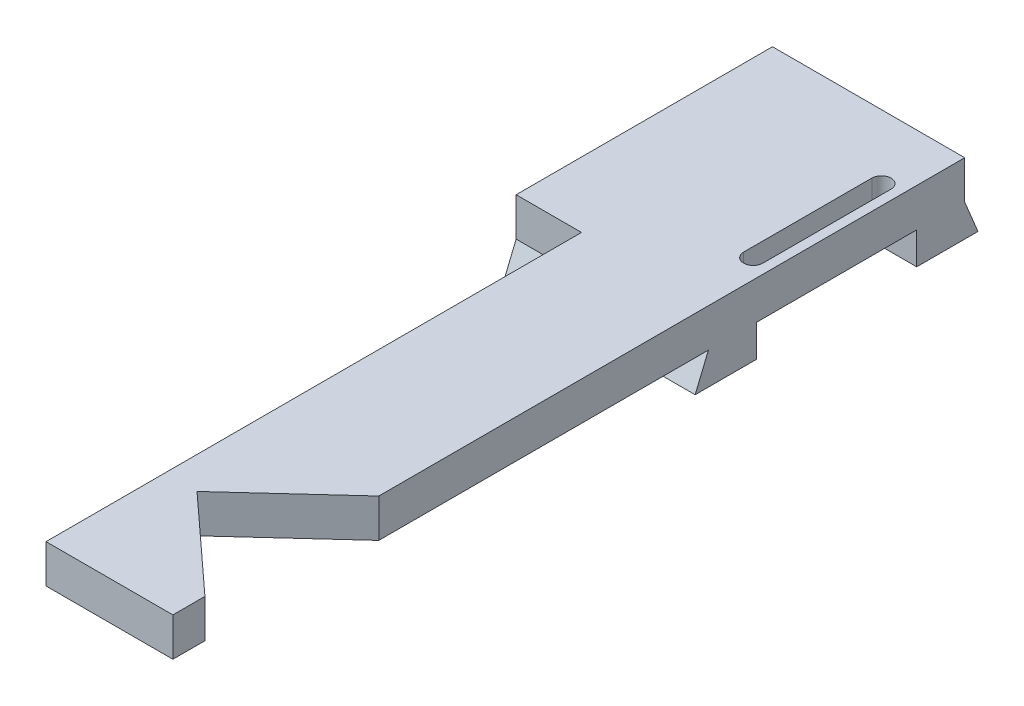
ISO-10303-21;
HEADER;
FILE_DESCRIPTION(('STEP AP214'),'2;1');
FILE_NAME('part.step','',(''),(''),'','','');
FILE_SCHEMA(('AUTOMOTIVE_DESIGN { 1 0 10303 214 1 1 1 1 }'));
ENDSEC;
DATA;
#1=APPLICATION_CONTEXT('core data for automotive mechanical design processes');
#2=APPLICATION_PROTOCOL_DEFINITION('international standard','automotive_design',2000,#1);
#3=PRODUCT_CONTEXT('',#1,'mechanical');
#4=PRODUCT('Part','Part','',(#3));
#5=PRODUCT_RELATED_PRODUCT_CATEGORY('part','',(#4));
#6=PRODUCT_DEFINITION_FORMATION('','',#4);
#7=PRODUCT_DEFINITION_CONTEXT('part definition',#1,'design');
#8=PRODUCT_DEFINITION('design','',#6,#7);
#9=PRODUCT_DEFINITION_SHAPE('','',#8);
#10=(LENGTH_UNIT() NAMED_UNIT(*) SI_UNIT(.MILLI.,.METRE.));
#11=(NAMED_UNIT(*) PLANE_ANGLE_UNIT() SI_UNIT($,.RADIAN.));
#12=(NAMED_UNIT(*) SI_UNIT($,.STERADIAN.) SOLID_ANGLE_UNIT());
#13=UNCERTAINTY_MEASURE_WITH_UNIT(LENGTH_MEASURE(1.E-05),#10,'distance_accuracy_value','');
#14=(GEOMETRIC_REPRESENTATION_CONTEXT(3) GLOBAL_UNCERTAINTY_ASSIGNED_CONTEXT((#13)) GLOBAL_UNIT_ASSIGNED_CONTEXT((#10,
#11,#12)) REPRESENTATION_CONTEXT('',''));
#15=CARTESIAN_POINT('',(0.,0.,0.));
#16=DIRECTION('',(0.,0.,1.));
#17=DIRECTION('',(1.,0.,0.));
#18=AXIS2_PLACEMENT_3D('',#15,#16,#17);
#19=CARTESIAN_POINT('',(0.,6.,0.));
#20=DIRECTION('',(1.,0.,0.));
#21=DIRECTION('',(0.,0.,-1.));
#22=AXIS2_PLACEMENT_3D('',#19,#20,#21);
#23=PLANE('',#22);
#24=DIRECTION('',(0.,0.,1.));
#25=VECTOR('',#24,1.);
#26=CARTESIAN_POINT('',(0.,0.,0.));
#27=LINE('',#26,#25);
#28=CARTESIAN_POINT('',(0.,0.,-12.5));
#29=VERTEX_POINT('',#28);
#30=CARTESIAN_POINT('',(0.,0.,12.5));
#31=VERTEX_POINT('',#30);
#32=EDGE_CURVE('E330',#29,#31,#27,.T.);
#33=ORIENTED_EDGE('',*,*,#32,.F.);
#34=DIRECTION('',(0.,1.,0.));
#35=VECTOR('',#34,1.);
#36=CARTESIAN_POINT('',(0.,0.,-12.5));
#37=LINE('',#36,#35);
#38=CARTESIAN_POINT('',(0.,-5.,-12.5));
#39=VERTEX_POINT('',#38);
#40=EDGE_CURVE('E275',#39,#29,#37,.T.);
#41=ORIENTED_EDGE('',*,*,#40,.F.);
#42=DIRECTION('',(0.,0.,-1.));
#43=VECTOR('',#42,1.);
#44=CARTESIAN_POINT('',(0.,-5.,0.));
#45=LINE('',#44,#43);
#46=CARTESIAN_POINT('',(0.,-5.,-22.069851171331));
#47=VERTEX_POINT('',#46);
#48=EDGE_CURVE('E255',#39,#47,#45,.T.);
#49=ORIENTED_EDGE('',*,*,#48,.T.);
#50=DIRECTION('',(0.,0.923959000291111,0.382491523802882));
#51=VECTOR('',#50,1.);
#52=CARTESIAN_POINT('',(0.,7.0681297190547,-17.074004684379));
#53=LINE('',#52,#51);
#54=CARTESIAN_POINT('',(0.,0.,-20.));
#55=VERTEX_POINT('',#54);
#56=EDGE_CURVE('E276',#47,#55,#53,.T.);
#57=ORIENTED_EDGE('',*,*,#56,.T.);
#58=DIRECTION('',(0.,-1.,0.));
#59=VECTOR('',#58,1.);
#60=CARTESIAN_POINT('',(0.,6.,-20.));
#61=LINE('',#60,#59);
#62=CARTESIAN_POINT('',(0.,6.,-20.));
#63=VERTEX_POINT('',#62);
#64=EDGE_CURVE('E363',#63,#55,#61,.T.);
#65=ORIENTED_EDGE('',*,*,#64,.F.);
#66=DIRECTION('',(0.,0.,1.));
#67=VECTOR('',#66,1.);
#68=CARTESIAN_POINT('',(0.,6.,0.));
#69=LINE('',#68,#67);
#70=CARTESIAN_POINT('',(0.,6.,71.4365829509075));
#71=VERTEX_POINT('',#70);
#72=EDGE_CURVE('E331',#63,#71,#69,.T.);
#73=ORIENTED_EDGE('',*,*,#72,.T.);
#74=DIRECTION('',(0.,1.,0.));
#75=VECTOR('',#74,1.);
#76=CARTESIAN_POINT('',(0.,-85.8775804075977,71.4365829509075));
#77=LINE('',#76,#75);
#78=CARTESIAN_POINT('',(0.,0.,71.4365829509075));
#79=VERTEX_POINT('',#78);
#80=EDGE_CURVE('E227',#79,#71,#77,.T.);
#81=ORIENTED_EDGE('',*,*,#80,.F.);
#82=DIRECTION('',(0.,0.,-1.));
#83=VECTOR('',#82,1.);
#84=CARTESIAN_POINT('',(0.,0.,0.));
#85=LINE('',#84,#83);
#86=CARTESIAN_POINT('',(0.,0.,20.));
#87=VERTEX_POINT('',#86);
#88=EDGE_CURVE('E454',#79,#87,#85,.T.);
#89=ORIENTED_EDGE('',*,*,#88,.T.);
#90=DIRECTION('',(0.,0.923959000291111,-0.382491523802882));
#91=VECTOR('',#90,1.);
#92=CARTESIAN_POINT('',(0.,7.06812971905469,17.074004684379));
#93=LINE('',#92,#91);
#94=CARTESIAN_POINT('',(0.,-5.,22.069851171331));
#95=VERTEX_POINT('',#94);
#96=EDGE_CURVE('E308',#95,#87,#93,.T.);
#97=ORIENTED_EDGE('',*,*,#96,.F.);
#98=DIRECTION('',(0.,0.,1.));
#99=VECTOR('',#98,1.);
#100=CARTESIAN_POINT('',(0.,-5.,0.));
#101=LINE('',#100,#99);
#102=CARTESIAN_POINT('',(0.,-5.,12.5));
#103=VERTEX_POINT('',#102);
#104=EDGE_CURVE('E302',#103,#95,#101,.T.);
#105=ORIENTED_EDGE('',*,*,#104,.F.);
#106=DIRECTION('',(0.,1.,0.));
#107=VECTOR('',#106,1.);
#108=CARTESIAN_POINT('',(0.,0.,12.5));
#109=LINE('',#108,#107);
#110=EDGE_CURVE('E281',#103,#31,#109,.T.);
#111=ORIENTED_EDGE('',*,*,#110,.T.);
#112=EDGE_LOOP('',(#33,#41,#49,#57,#65,#73,#81,#89,#97,#105,#111));
#113=FACE_BOUND('',#112,.T.);
#114=ADVANCED_FACE('F43',(#113),#23,.T.);
#115=CARTESIAN_POINT('',(0.,6.,-20.));
#116=DIRECTION('',(0.,0.,-1.));
#117=DIRECTION('',(-1.,0.,0.));
#118=AXIS2_PLACEMENT_3D('',#115,#116,#117);
#119=PLANE('',#118);
#120=DIRECTION('',(1.,0.,0.));
#121=VECTOR('',#120,1.);
#122=CARTESIAN_POINT('',(0.,0.,-20.));
#123=LINE('',#122,#121);
#124=CARTESIAN_POINT('',(-30.,0.,-20.));
#125=VERTEX_POINT('',#124);
#126=EDGE_CURVE('E348',#125,#55,#123,.T.);
#127=ORIENTED_EDGE('',*,*,#126,.F.);
#128=DIRECTION('',(0.,-1.,0.));
#129=VECTOR('',#128,1.);
#130=CARTESIAN_POINT('',(-30.,6.,-20.));
#131=LINE('',#130,#129);
#132=CARTESIAN_POINT('',(-30.,6.,-20.));
#133=VERTEX_POINT('',#132);
#134=EDGE_CURVE('E360',#133,#125,#131,.T.);
#135=ORIENTED_EDGE('',*,*,#134,.F.);
#136=DIRECTION('',(1.,0.,0.));
#137=VECTOR('',#136,1.);
#138=CARTESIAN_POINT('',(0.,6.,-20.));
#139=LINE('',#138,#137);
#140=EDGE_CURVE('E334',#133,#63,#139,.T.);
#141=ORIENTED_EDGE('',*,*,#140,.T.);
#142=ORIENTED_EDGE('',*,*,#64,.T.);
#143=EDGE_LOOP('',(#127,#135,#141,#142));
#144=FACE_BOUND('',#143,.T.);
#145=ADVANCED_FACE('F406',(#144),#119,.T.);
#146=CARTESIAN_POINT('',(-30.,6.,0.));
#147=DIRECTION('',(1.,0.,0.));
#148=DIRECTION('',(0.,0.,-1.));
#149=AXIS2_PLACEMENT_3D('',#146,#147,#148);
#150=PLANE('',#149);
#151=ORIENTED_EDGE('',*,*,#134,.T.);
#152=DIRECTION('',(0.,0.923959000291111,0.382491523802882));
#153=VECTOR('',#152,1.);
#154=CARTESIAN_POINT('',(-30.,7.0681297190547,-17.074004684379));
#155=LINE('',#154,#153);
#156=CARTESIAN_POINT('',(-30.,-5.,-22.069851171331));
#157=VERTEX_POINT('',#156);
#158=EDGE_CURVE('E265',#157,#125,#155,.T.);
#159=ORIENTED_EDGE('',*,*,#158,.F.);
#160=DIRECTION('',(0.,0.,-1.));
#161=VECTOR('',#160,1.);
#162=CARTESIAN_POINT('',(-30.,-5.,0.));
#163=LINE('',#162,#161);
#164=CARTESIAN_POINT('',(-30.,-5.,-12.5));
#165=VERTEX_POINT('',#164);
#166=EDGE_CURVE('E277',#165,#157,#163,.T.);
#167=ORIENTED_EDGE('',*,*,#166,.F.);
#168=DIRECTION('',(0.,1.,0.));
#169=VECTOR('',#168,1.);
#170=CARTESIAN_POINT('',(-30.,0.,-12.5));
#171=LINE('',#170,#169);
#172=CARTESIAN_POINT('',(-30.,0.,-12.5));
#173=VERTEX_POINT('',#172);
#174=EDGE_CURVE('E271',#165,#173,#171,.T.);
#175=ORIENTED_EDGE('',*,*,#174,.T.);
#176=DIRECTION('',(0.,0.,1.));
#177=VECTOR('',#176,1.);
#178=CARTESIAN_POINT('',(-30.,0.,0.));
#179=LINE('',#178,#177);
#180=CARTESIAN_POINT('',(-30.,0.,12.5));
#181=VERTEX_POINT('',#180);
#182=EDGE_CURVE('E352',#173,#181,#179,.T.);
#183=ORIENTED_EDGE('',*,*,#182,.T.);
#184=DIRECTION('',(0.,1.,0.));
#185=VECTOR('',#184,1.);
#186=CARTESIAN_POINT('',(-30.,0.,12.5));
#187=LINE('',#186,#185);
#188=CARTESIAN_POINT('',(-30.,-5.,12.5));
#189=VERTEX_POINT('',#188);
#190=EDGE_CURVE('E298',#189,#181,#187,.T.);
#191=ORIENTED_EDGE('',*,*,#190,.F.);
#192=DIRECTION('',(0.,0.,1.));
#193=VECTOR('',#192,1.);
#194=CARTESIAN_POINT('',(-30.,-5.,0.));
#195=LINE('',#194,#193);
#196=CARTESIAN_POINT('',(-30.,-5.,22.069851171331));
#197=VERTEX_POINT('',#196);
#198=EDGE_CURVE('E309',#189,#197,#195,.T.);
#199=ORIENTED_EDGE('',*,*,#198,.T.);
#200=DIRECTION('',(0.,0.923959000291111,-0.382491523802882));
#201=VECTOR('',#200,1.);
#202=CARTESIAN_POINT('',(-30.,7.06812971905469,17.074004684379));
#203=LINE('',#202,#201);
#204=CARTESIAN_POINT('',(-30.,0.,20.));
#205=VERTEX_POINT('',#204);
#206=EDGE_CURVE('E304',#197,#205,#203,.T.);
#207=ORIENTED_EDGE('',*,*,#206,.T.);
#208=DIRECTION('',(0.,-1.,0.));
#209=VECTOR('',#208,1.);
#210=CARTESIAN_POINT('',(-30.,6.,20.));
#211=LINE('',#210,#209);
#212=CARTESIAN_POINT('',(-30.,6.,20.));
#213=VERTEX_POINT('',#212);
#214=EDGE_CURVE('E345',#213,#205,#211,.T.);
#215=ORIENTED_EDGE('',*,*,#214,.F.);
#216=DIRECTION('',(0.,0.,1.));
#217=VECTOR('',#216,1.);
#218=CARTESIAN_POINT('',(-30.,6.,0.));
#219=LINE('',#218,#217);
#220=EDGE_CURVE('E339',#133,#213,#219,.T.);
#221=ORIENTED_EDGE('',*,*,#220,.F.);
#222=EDGE_LOOP('',(#151,#159,#167,#175,#183,#191,#199,#207,#215,#221));
#223=FACE_BOUND('',#222,.T.);
#224=ADVANCED_FACE('F411',(#223),#150,.F.);
#225=CARTESIAN_POINT('',(0.,6.,20.));
#226=DIRECTION('',(0.,0.,-1.));
#227=DIRECTION('',(-1.,0.,0.));
#228=AXIS2_PLACEMENT_3D('',#225,#226,#227);
#229=PLANE('',#228);
#230=DIRECTION('',(1.,0.,0.));
#231=VECTOR('',#230,1.);
#232=CARTESIAN_POINT('',(0.,0.,20.));
#233=LINE('',#232,#231);
#234=CARTESIAN_POINT('',(-19.8018723292226,0.,20.));
#235=VERTEX_POINT('',#234);
#236=EDGE_CURVE('E335',#205,#235,#233,.T.);
#237=ORIENTED_EDGE('',*,*,#236,.T.);
#238=DIRECTION('',(0.,1.,0.));
#239=VECTOR('',#238,1.);
#240=CARTESIAN_POINT('',(-19.8018723292226,-85.8775804075977,20.));
#241=LINE('',#240,#239);
#242=CARTESIAN_POINT('',(-19.8018723292226,6.,20.));
#243=VERTEX_POINT('',#242);
#244=EDGE_CURVE('E58',#235,#243,#241,.T.);
#245=ORIENTED_EDGE('',*,*,#244,.T.);
#246=DIRECTION('',(1.,0.,0.));
#247=VECTOR('',#246,1.);
#248=CARTESIAN_POINT('',(0.,6.,20.));
#249=LINE('',#248,#247);
#250=EDGE_CURVE('E342',#213,#243,#249,.T.);
#251=ORIENTED_EDGE('',*,*,#250,.F.);
#252=ORIENTED_EDGE('',*,*,#214,.T.);
#253=EDGE_LOOP('',(#237,#245,#251,#252));
#254=FACE_BOUND('',#253,.T.);
#255=ADVANCED_FACE('F480',(#254),#229,.F.);
#256=CARTESIAN_POINT('',(0.,6.,0.));
#257=DIRECTION('',(0.,1.,0.));
#258=DIRECTION('',(0.,0.,1.));
#259=AXIS2_PLACEMENT_3D('',#256,#257,#258);
#260=PLANE('',#259);
#261=CARTESIAN_POINT('',(-3.,6.,-10.));
#262=DIRECTION('',(0.,1.,0.));
#263=DIRECTION('',(0.,0.,1.));
#264=AXIS2_PLACEMENT_3D('',#261,#262,#263);
#265=CIRCLE('',#264,1.5);
#266=CARTESIAN_POINT('',(-1.5,6.,-10.));
#267=VERTEX_POINT('',#266);
#268=CARTESIAN_POINT('',(-4.5,6.,-10.));
#269=VERTEX_POINT('',#268);
#270=EDGE_CURVE('E244',#267,#269,#265,.T.);
#271=ORIENTED_EDGE('',*,*,#270,.F.);
#272=DIRECTION('',(0.,0.,-1.));
#273=VECTOR('',#272,1.);
#274=CARTESIAN_POINT('',(-1.5,6.,-10.));
#275=LINE('',#274,#273);
#276=CARTESIAN_POINT('',(-1.5,6.,10.));
#277=VERTEX_POINT('',#276);
#278=EDGE_CURVE('E247',#277,#267,#275,.T.);
#279=ORIENTED_EDGE('',*,*,#278,.F.);
#280=CARTESIAN_POINT('',(-3.,6.,10.));
#281=DIRECTION('',(0.,1.,0.));
#282=DIRECTION('',(0.,0.,1.));
#283=AXIS2_PLACEMENT_3D('',#280,#281,#282);
#284=CIRCLE('',#283,1.5);
#285=CARTESIAN_POINT('',(-4.5,6.,10.));
#286=VERTEX_POINT('',#285);
#287=EDGE_CURVE('E236',#286,#277,#284,.T.);
#288=ORIENTED_EDGE('',*,*,#287,.F.);
#289=DIRECTION('',(0.,0.,1.));
#290=VECTOR('',#289,1.);
#291=CARTESIAN_POINT('',(-4.5,6.,-10.));
#292=LINE('',#291,#290);
#293=EDGE_CURVE('E240',#269,#286,#292,.T.);
#294=ORIENTED_EDGE('',*,*,#293,.F.);
#295=EDGE_LOOP('',(#271,#279,#288,#294));
#296=FACE_BOUND('',#295,.T.);
#297=ORIENTED_EDGE('',*,*,#72,.F.);
#298=ORIENTED_EDGE('',*,*,#140,.F.);
#299=ORIENTED_EDGE('',*,*,#220,.T.);
#300=ORIENTED_EDGE('',*,*,#250,.T.);
#301=DIRECTION('',(0.,0.,1.));
#302=VECTOR('',#301,1.);
#303=CARTESIAN_POINT('',(-19.8018723292226,6.,0.));
#304=LINE('',#303,#302);
#305=CARTESIAN_POINT('',(-19.8018723292226,6.,103.563417049093));
#306=VERTEX_POINT('',#305);
#307=EDGE_CURVE('E210',#243,#306,#304,.T.);
#308=ORIENTED_EDGE('',*,*,#307,.T.);
#309=DIRECTION('',(1.,0.,0.));
#310=VECTOR('',#309,1.);
#311=CARTESIAN_POINT('',(0.,6.,103.563417049093));
#312=LINE('',#311,#310);
#313=CARTESIAN_POINT('',(0.,6.,103.563417049093));
#314=VERTEX_POINT('',#313);
#315=EDGE_CURVE('E191',#306,#314,#312,.T.);
#316=ORIENTED_EDGE('',*,*,#315,.T.);
#317=DIRECTION('',(0.,0.,1.));
#318=VECTOR('',#317,1.);
#319=CARTESIAN_POINT('',(0.,6.,0.));
#320=LINE('',#319,#318);
#321=CARTESIAN_POINT('',(0.,6.,98.5634170490926));
#322=VERTEX_POINT('',#321);
#323=EDGE_CURVE('E183',#322,#314,#320,.T.);
#324=ORIENTED_EDGE('',*,*,#323,.F.);
#325=DIRECTION('',(-0.737277336810125,0.,-0.675590207615659));
#326=VECTOR('',#325,1.);
#327=CARTESIAN_POINT('',(-49.0941767450558,6.,53.5768924348769));
#328=LINE('',#327,#326);
#329=CARTESIAN_POINT('',(-14.8018723292226,6.,85.));
#330=VERTEX_POINT('',#329);
#331=EDGE_CURVE('E198',#322,#330,#328,.T.);
#332=ORIENTED_EDGE('',*,*,#331,.T.);
#333=DIRECTION('',(0.737277336810125,0.,-0.675590207615659));
#334=VECTOR('',#333,1.);
#335=CARTESIAN_POINT('',(35.5823725927426,6.,38.8313456986744));
#336=LINE('',#335,#334);
#337=EDGE_CURVE('E207',#330,#71,#336,.T.);
#338=ORIENTED_EDGE('',*,*,#337,.T.);
#339=EDGE_LOOP('',(#297,#298,#299,#300,#308,#316,#324,#332,#338));
#340=FACE_BOUND('',#339,.T.);
#341=ADVANCED_FACE('F196',(#296,#340),#260,.T.);
#342=CARTESIAN_POINT('',(0.,0.,0.));
#343=DIRECTION('',(0.,1.,0.));
#344=DIRECTION('',(0.,0.,1.));
#345=AXIS2_PLACEMENT_3D('',#342,#343,#344);
#346=PLANE('',#345);
#347=DIRECTION('',(0.,0.,-1.));
#348=VECTOR('',#347,1.);
#349=CARTESIAN_POINT('',(-1.5,0.,0.));
#350=LINE('',#349,#348);
#351=CARTESIAN_POINT('',(-1.5,0.,10.));
#352=VERTEX_POINT('',#351);
#353=CARTESIAN_POINT('',(-1.5,0.,-10.));
#354=VERTEX_POINT('',#353);
#355=EDGE_CURVE('E51',#352,#354,#350,.T.);
#356=ORIENTED_EDGE('',*,*,#355,.T.);
#357=CARTESIAN_POINT('',(-3.,0.,-10.));
#358=DIRECTION('',(0.,1.,0.));
#359=DIRECTION('',(0.,0.,1.));
#360=AXIS2_PLACEMENT_3D('',#357,#358,#359);
#361=CIRCLE('',#360,1.5);
#362=CARTESIAN_POINT('',(-4.5,0.,-10.));
#363=VERTEX_POINT('',#362);
#364=EDGE_CURVE('E11',#354,#363,#361,.T.);
#365=ORIENTED_EDGE('',*,*,#364,.T.);
#366=DIRECTION('',(0.,0.,1.));
#367=VECTOR('',#366,1.);
#368=CARTESIAN_POINT('',(-4.5,0.,0.));
#369=LINE('',#368,#367);
#370=CARTESIAN_POINT('',(-4.5,0.,10.));
#371=VERTEX_POINT('',#370);
#372=EDGE_CURVE('E366',#363,#371,#369,.T.);
#373=ORIENTED_EDGE('',*,*,#372,.T.);
#374=CARTESIAN_POINT('',(-3.,0.,10.));
#375=DIRECTION('',(0.,1.,0.));
#376=DIRECTION('',(0.,0.,1.));
#377=AXIS2_PLACEMENT_3D('',#374,#375,#376);
#378=CIRCLE('',#377,1.5);
#379=EDGE_CURVE('E370',#371,#352,#378,.T.);
#380=ORIENTED_EDGE('',*,*,#379,.T.);
#381=EDGE_LOOP('',(#356,#365,#373,#380));
#382=FACE_BOUND('',#381,.T.);
#383=ORIENTED_EDGE('',*,*,#182,.F.);
#384=DIRECTION('',(-1.,0.,0.));
#385=VECTOR('',#384,1.);
#386=CARTESIAN_POINT('',(10.7973168630649,0.,-12.5));
#387=LINE('',#386,#385);
#388=EDGE_CURVE('E285',#29,#173,#387,.T.);
#389=ORIENTED_EDGE('',*,*,#388,.F.);
#390=ORIENTED_EDGE('',*,*,#32,.T.);
#391=DIRECTION('',(-1.,0.,0.));
#392=VECTOR('',#391,1.);
#393=CARTESIAN_POINT('',(10.7973168630649,0.,12.5));
#394=LINE('',#393,#392);
#395=EDGE_CURVE('E315',#31,#181,#394,.T.);
#396=ORIENTED_EDGE('',*,*,#395,.T.);
#397=EDGE_LOOP('',(#383,#389,#390,#396));
#398=FACE_BOUND('',#397,.T.);
#399=ADVANCED_FACE('F376',(#382,#398),#346,.F.);
#400=CARTESIAN_POINT('',(10.7973168630649,7.06812971905469,17.074004684379));
#401=DIRECTION('',(0.,0.382491523802882,0.923959000291111));
#402=DIRECTION('',(0.,-0.923959000291111,0.382491523802882));
#403=AXIS2_PLACEMENT_3D('',#400,#401,#402);
#404=PLANE('',#403);
#405=DIRECTION('',(-1.,0.,0.));
#406=VECTOR('',#405,1.);
#407=CARTESIAN_POINT('',(10.7973168630649,-5.,22.069851171331));
#408=LINE('',#407,#406);
#409=EDGE_CURVE('E319',#95,#197,#408,.T.);
#410=ORIENTED_EDGE('',*,*,#409,.F.);
#411=ORIENTED_EDGE('',*,*,#96,.T.);
#412=DIRECTION('',(-1.,0.,0.));
#413=VECTOR('',#412,1.);
#414=CARTESIAN_POINT('',(0.,0.,20.));
#415=LINE('',#414,#413);
#416=EDGE_CURVE('E66',#87,#235,#415,.T.);
#417=ORIENTED_EDGE('',*,*,#416,.T.);
#418=ORIENTED_EDGE('',*,*,#236,.F.);
#419=ORIENTED_EDGE('',*,*,#206,.F.);
#420=EDGE_LOOP('',(#410,#411,#417,#418,#419));
#421=FACE_BOUND('',#420,.T.);
#422=ADVANCED_FACE('F469',(#421),#404,.T.);
#423=CARTESIAN_POINT('',(10.7973168630649,0.,12.5));
#424=DIRECTION('',(0.,0.,1.));
#425=DIRECTION('',(1.,0.,0.));
#426=AXIS2_PLACEMENT_3D('',#423,#424,#425);
#427=PLANE('',#426);
#428=ORIENTED_EDGE('',*,*,#110,.F.);
#429=DIRECTION('',(-1.,0.,0.));
#430=VECTOR('',#429,1.);
#431=CARTESIAN_POINT('',(10.7973168630649,-5.,12.5));
#432=LINE('',#431,#430);
#433=EDGE_CURVE('E303',#103,#189,#432,.T.);
#434=ORIENTED_EDGE('',*,*,#433,.T.);
#435=ORIENTED_EDGE('',*,*,#190,.T.);
#436=ORIENTED_EDGE('',*,*,#395,.F.);
#437=EDGE_LOOP('',(#428,#434,#435,#436));
#438=FACE_BOUND('',#437,.T.);
#439=ADVANCED_FACE('F472',(#438),#427,.F.);
#440=CARTESIAN_POINT('',(10.7973168630649,-5.,0.));
#441=DIRECTION('',(0.,-1.,0.));
#442=DIRECTION('',(0.,0.,-1.));
#443=AXIS2_PLACEMENT_3D('',#440,#441,#442);
#444=PLANE('',#443);
#445=ORIENTED_EDGE('',*,*,#433,.F.);
#446=ORIENTED_EDGE('',*,*,#104,.T.);
#447=ORIENTED_EDGE('',*,*,#409,.T.);
#448=ORIENTED_EDGE('',*,*,#198,.F.);
#449=EDGE_LOOP('',(#445,#446,#447,#448));
#450=FACE_BOUND('',#449,.T.);
#451=ADVANCED_FACE('F466',(#450),#444,.T.);
#452=CARTESIAN_POINT('',(10.7973168630649,0.,-12.5));
#453=DIRECTION('',(0.,0.,1.));
#454=DIRECTION('',(1.,0.,0.));
#455=AXIS2_PLACEMENT_3D('',#452,#453,#454);
#456=PLANE('',#455);
#457=DIRECTION('',(-1.,0.,0.));
#458=VECTOR('',#457,1.);
#459=CARTESIAN_POINT('',(10.7973168630649,-5.,-12.5));
#460=LINE('',#459,#458);
#461=EDGE_CURVE('E269',#39,#165,#460,.T.);
#462=ORIENTED_EDGE('',*,*,#461,.F.);
#463=ORIENTED_EDGE('',*,*,#40,.T.);
#464=ORIENTED_EDGE('',*,*,#388,.T.);
#465=ORIENTED_EDGE('',*,*,#174,.F.);
#466=EDGE_LOOP('',(#462,#463,#464,#465));
#467=FACE_BOUND('',#466,.T.);
#468=ADVANCED_FACE('F419',(#467),#456,.T.);
#469=CARTESIAN_POINT('',(10.7973168630649,7.0681297190547,-17.074004684379));
#470=DIRECTION('',(0.,-0.382491523802882,0.923959000291111));
#471=DIRECTION('',(0.,-0.923959000291111,-0.382491523802882));
#472=AXIS2_PLACEMENT_3D('',#469,#470,#471);
#473=PLANE('',#472);
#474=ORIENTED_EDGE('',*,*,#56,.F.);
#475=DIRECTION('',(-1.,0.,0.));
#476=VECTOR('',#475,1.);
#477=CARTESIAN_POINT('',(10.7973168630649,-5.,-22.069851171331));
#478=LINE('',#477,#476);
#479=EDGE_CURVE('E270',#47,#157,#478,.T.);
#480=ORIENTED_EDGE('',*,*,#479,.T.);
#481=ORIENTED_EDGE('',*,*,#158,.T.);
#482=ORIENTED_EDGE('',*,*,#126,.T.);
#483=EDGE_LOOP('',(#474,#480,#481,#482));
#484=FACE_BOUND('',#483,.T.);
#485=ADVANCED_FACE('F431',(#484),#473,.F.);
#486=CARTESIAN_POINT('',(10.7973168630649,-5.,0.));
#487=DIRECTION('',(0.,1.,0.));
#488=DIRECTION('',(0.,0.,1.));
#489=AXIS2_PLACEMENT_3D('',#486,#487,#488);
#490=PLANE('',#489);
#491=ORIENTED_EDGE('',*,*,#48,.F.);
#492=ORIENTED_EDGE('',*,*,#461,.T.);
#493=ORIENTED_EDGE('',*,*,#166,.T.);
#494=ORIENTED_EDGE('',*,*,#479,.F.);
#495=EDGE_LOOP('',(#491,#492,#493,#494));
#496=FACE_BOUND('',#495,.T.);
#497=ADVANCED_FACE('F423',(#496),#490,.F.);
#498=CARTESIAN_POINT('',(-3.,-5.,-10.));
#499=DIRECTION('',(0.,1.,0.));
#500=DIRECTION('',(0.,0.,1.));
#501=AXIS2_PLACEMENT_3D('',#498,#499,#500);
#502=CYLINDRICAL_SURFACE('',#501,1.5);
#503=DIRECTION('',(0.,1.,0.));
#504=VECTOR('',#503,1.);
#505=CARTESIAN_POINT('',(-1.5,-5.,-10.));
#506=LINE('',#505,#504);
#507=EDGE_CURVE('E252',#354,#267,#506,.T.);
#508=ORIENTED_EDGE('',*,*,#507,.T.);
#509=ORIENTED_EDGE('',*,*,#270,.T.);
#510=DIRECTION('',(0.,1.,0.));
#511=VECTOR('',#510,1.);
#512=CARTESIAN_POINT('',(-4.5,-5.,-10.));
#513=LINE('',#512,#511);
#514=EDGE_CURVE('E251',#363,#269,#513,.T.);
#515=ORIENTED_EDGE('',*,*,#514,.F.);
#516=ORIENTED_EDGE('',*,*,#364,.F.);
#517=EDGE_LOOP('',(#508,#509,#515,#516));
#518=FACE_BOUND('',#517,.T.);
#519=ADVANCED_FACE('F392',(#518),#502,.F.);
#520=CARTESIAN_POINT('',(-1.5,-5.,-10.));
#521=DIRECTION('',(1.,0.,0.));
#522=DIRECTION('',(0.,0.,-1.));
#523=AXIS2_PLACEMENT_3D('',#520,#521,#522);
#524=PLANE('',#523);
#525=DIRECTION('',(0.,1.,0.));
#526=VECTOR('',#525,1.);
#527=CARTESIAN_POINT('',(-1.5,-5.,10.));
#528=LINE('',#527,#526);
#529=EDGE_CURVE('E256',#352,#277,#528,.T.);
#530=ORIENTED_EDGE('',*,*,#529,.T.);
#531=ORIENTED_EDGE('',*,*,#278,.T.);
#532=ORIENTED_EDGE('',*,*,#507,.F.);
#533=ORIENTED_EDGE('',*,*,#355,.F.);
#534=EDGE_LOOP('',(#530,#531,#532,#533));
#535=FACE_BOUND('',#534,.T.);
#536=ADVANCED_FACE('F382',(#535),#524,.F.);
#537=CARTESIAN_POINT('',(-3.,-5.,10.));
#538=DIRECTION('',(0.,1.,0.));
#539=DIRECTION('',(0.,0.,1.));
#540=AXIS2_PLACEMENT_3D('',#537,#538,#539);
#541=CYLINDRICAL_SURFACE('',#540,1.5);
#542=DIRECTION('',(0.,1.,0.));
#543=VECTOR('',#542,1.);
#544=CARTESIAN_POINT('',(-4.5,-5.,10.));
#545=LINE('',#544,#543);
#546=EDGE_CURVE('E259',#371,#286,#545,.T.);
#547=ORIENTED_EDGE('',*,*,#546,.T.);
#548=ORIENTED_EDGE('',*,*,#287,.T.);
#549=ORIENTED_EDGE('',*,*,#529,.F.);
#550=ORIENTED_EDGE('',*,*,#379,.F.);
#551=EDGE_LOOP('',(#547,#548,#549,#550));
#552=FACE_BOUND('',#551,.T.);
#553=ADVANCED_FACE('F384',(#552),#541,.F.);
#554=CARTESIAN_POINT('',(-4.5,-5.,-10.));
#555=DIRECTION('',(-1.,0.,0.));
#556=DIRECTION('',(0.,0.,1.));
#557=AXIS2_PLACEMENT_3D('',#554,#555,#556);
#558=PLANE('',#557);
#559=ORIENTED_EDGE('',*,*,#514,.T.);
#560=ORIENTED_EDGE('',*,*,#293,.T.);
#561=ORIENTED_EDGE('',*,*,#546,.F.);
#562=ORIENTED_EDGE('',*,*,#372,.F.);
#563=EDGE_LOOP('',(#559,#560,#561,#562));
#564=FACE_BOUND('',#563,.T.);
#565=ADVANCED_FACE('F394',(#564),#558,.F.);
#566=CARTESIAN_POINT('',(0.,-85.8775804075977,0.));
#567=DIRECTION('',(-1.,0.,0.));
#568=DIRECTION('',(0.,0.,1.));
#569=AXIS2_PLACEMENT_3D('',#566,#567,#568);
#570=PLANE('',#569);
#571=DIRECTION('',(0.,1.,0.));
#572=VECTOR('',#571,1.);
#573=CARTESIAN_POINT('',(0.,-85.8775804075977,103.563417049093));
#574=LINE('',#573,#572);
#575=CARTESIAN_POINT('',(0.,0.,103.563417049093));
#576=VERTEX_POINT('',#575);
#577=EDGE_CURVE('E218',#576,#314,#574,.T.);
#578=ORIENTED_EDGE('',*,*,#577,.F.);
#579=DIRECTION('',(0.,0.,-1.));
#580=VECTOR('',#579,1.);
#581=CARTESIAN_POINT('',(0.,0.,0.));
#582=LINE('',#581,#580);
#583=CARTESIAN_POINT('',(0.,0.,98.5634170490926));
#584=VERTEX_POINT('',#583);
#585=EDGE_CURVE('E185',#576,#584,#582,.T.);
#586=ORIENTED_EDGE('',*,*,#585,.T.);
#587=DIRECTION('',(0.,1.,0.));
#588=VECTOR('',#587,1.);
#589=CARTESIAN_POINT('',(0.,-85.8775804075977,98.5634170490926));
#590=LINE('',#589,#588);
#591=EDGE_CURVE('E179',#584,#322,#590,.T.);
#592=ORIENTED_EDGE('',*,*,#591,.T.);
#593=ORIENTED_EDGE('',*,*,#323,.T.);
#594=EDGE_LOOP('',(#578,#586,#592,#593));
#595=FACE_BOUND('',#594,.T.);
#596=ADVANCED_FACE('F182',(#595),#570,.F.);
#597=CARTESIAN_POINT('',(0.,-85.8775804075977,103.563417049093));
#598=DIRECTION('',(0.,0.,1.));
#599=DIRECTION('',(1.,0.,0.));
#600=AXIS2_PLACEMENT_3D('',#597,#598,#599);
#601=PLANE('',#600);
#602=DIRECTION('',(-1.,0.,0.));
#603=VECTOR('',#602,1.);
#604=CARTESIAN_POINT('',(0.,0.,103.563417049093));
#605=LINE('',#604,#603);
#606=CARTESIAN_POINT('',(-19.8018723292226,0.,103.563417049093));
#607=VERTEX_POINT('',#606);
#608=EDGE_CURVE('E444',#576,#607,#605,.T.);
#609=ORIENTED_EDGE('',*,*,#608,.F.);
#610=ORIENTED_EDGE('',*,*,#577,.T.);
#611=ORIENTED_EDGE('',*,*,#315,.F.);
#612=DIRECTION('',(0.,1.,0.));
#613=VECTOR('',#612,1.);
#614=CARTESIAN_POINT('',(-19.8018723292226,-85.8775804075977,103.563417049093));
#615=LINE('',#614,#613);
#616=EDGE_CURVE('E222',#607,#306,#615,.T.);
#617=ORIENTED_EDGE('',*,*,#616,.F.);
#618=EDGE_LOOP('',(#609,#610,#611,#617));
#619=FACE_BOUND('',#618,.T.);
#620=ADVANCED_FACE('F401',(#619),#601,.T.);
#621=CARTESIAN_POINT('',(-19.8018723292226,-85.8775804075977,0.));
#622=DIRECTION('',(-1.,0.,0.));
#623=DIRECTION('',(0.,0.,1.));
#624=AXIS2_PLACEMENT_3D('',#621,#622,#623);
#625=PLANE('',#624);
#626=DIRECTION('',(0.,0.,-1.));
#627=VECTOR('',#626,1.);
#628=CARTESIAN_POINT('',(-19.8018723292226,0.,0.));
#629=LINE('',#628,#627);
#630=EDGE_CURVE('E441',#607,#235,#629,.T.);
#631=ORIENTED_EDGE('',*,*,#630,.F.);
#632=ORIENTED_EDGE('',*,*,#616,.T.);
#633=ORIENTED_EDGE('',*,*,#307,.F.);
#634=ORIENTED_EDGE('',*,*,#244,.F.);
#635=EDGE_LOOP('',(#631,#632,#633,#634));
#636=FACE_BOUND('',#635,.T.);
#637=ADVANCED_FACE('F438',(#636),#625,.T.);
#638=CARTESIAN_POINT('',(35.5823725927426,-85.8775804075977,38.8313456986744));
#639=DIRECTION('',(0.675590207615659,0.,0.737277336810125));
#640=DIRECTION('',(0.737277336810125,0.,-0.675590207615659));
#641=AXIS2_PLACEMENT_3D('',#638,#639,#640);
#642=PLANE('',#641);
#643=DIRECTION('',(-0.737277336810125,0.,0.675590207615659));
#644=VECTOR('',#643,1.);
#645=CARTESIAN_POINT('',(35.5823725927426,0.,38.8313456986744));
#646=LINE('',#645,#644);
#647=CARTESIAN_POINT('',(-14.8018723292226,0.,85.));
#648=VERTEX_POINT('',#647);
#649=EDGE_CURVE('E221',#79,#648,#646,.T.);
#650=ORIENTED_EDGE('',*,*,#649,.F.);
#651=ORIENTED_EDGE('',*,*,#80,.T.);
#652=ORIENTED_EDGE('',*,*,#337,.F.);
#653=DIRECTION('',(0.,1.,0.));
#654=VECTOR('',#653,1.);
#655=CARTESIAN_POINT('',(-14.8018723292226,-85.8775804075977,85.));
#656=LINE('',#655,#654);
#657=EDGE_CURVE('E190',#648,#330,#656,.T.);
#658=ORIENTED_EDGE('',*,*,#657,.F.);
#659=EDGE_LOOP('',(#650,#651,#652,#658));
#660=FACE_BOUND('',#659,.T.);
#661=ADVANCED_FACE('F462',(#660),#642,.T.);
#662=CARTESIAN_POINT('',(-49.0941767450558,-85.8775804075977,53.5768924348769));
#663=DIRECTION('',(0.675590207615659,0.,-0.737277336810125));
#664=DIRECTION('',(-0.737277336810125,0.,-0.675590207615659));
#665=AXIS2_PLACEMENT_3D('',#662,#663,#664);
#666=PLANE('',#665);
#667=DIRECTION('',(0.737277336810125,0.,0.675590207615659));
#668=VECTOR('',#667,1.);
#669=CARTESIAN_POINT('',(-49.0941767450558,0.,53.5768924348769));
#670=LINE('',#669,#668);
#671=EDGE_CURVE('E233',#648,#584,#670,.T.);
#672=ORIENTED_EDGE('',*,*,#671,.F.);
#673=ORIENTED_EDGE('',*,*,#657,.T.);
#674=ORIENTED_EDGE('',*,*,#331,.F.);
#675=ORIENTED_EDGE('',*,*,#591,.F.);
#676=EDGE_LOOP('',(#672,#673,#674,#675));
#677=FACE_BOUND('',#676,.T.);
#678=ADVANCED_FACE('F203',(#677),#666,.T.);
#679=CARTESIAN_POINT('',(0.,0.,0.));
#680=DIRECTION('',(0.,1.,0.));
#681=DIRECTION('',(0.,0.,1.));
#682=AXIS2_PLACEMENT_3D('',#679,#680,#681);
#683=PLANE('',#682);
#684=ORIENTED_EDGE('',*,*,#608,.T.);
#685=ORIENTED_EDGE('',*,*,#630,.T.);
#686=ORIENTED_EDGE('',*,*,#416,.F.);
#687=ORIENTED_EDGE('',*,*,#88,.F.);
#688=ORIENTED_EDGE('',*,*,#649,.T.);
#689=ORIENTED_EDGE('',*,*,#671,.T.);
#690=ORIENTED_EDGE('',*,*,#585,.F.);
#691=EDGE_LOOP('',(#684,#685,#686,#687,#688,#689,#690));
#692=FACE_BOUND('',#691,.T.);
#693=ADVANCED_FACE('F460',(#692),#683,.F.);
#694=CLOSED_SHELL('',(#114,#145,#224,#255,#341,#399,#422,#439,#451,#468,#485,#497,#519,#536,
#553,#565,#596,#620,#637,#661,#678,#693));
#695=MANIFOLD_SOLID_BREP('B2',#694);
#696=ADVANCED_BREP_SHAPE_REPRESENTATION('',(#18,#695),#14);
#697=SHAPE_DEFINITION_REPRESENTATION(#9,#696);
ENDSEC;
END-ISO-10303-21;
